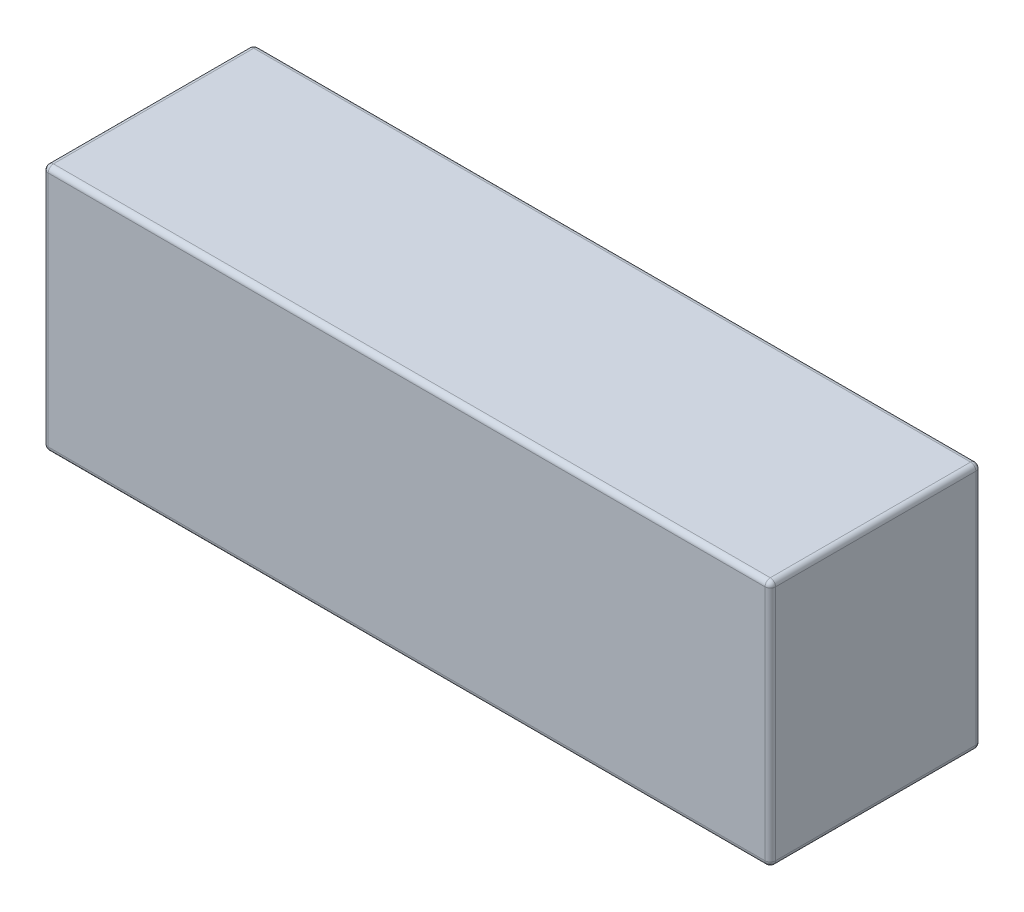
ISO-10303-21;
HEADER;
FILE_DESCRIPTION(('STEP AP214'),'2;1');
FILE_NAME('part.step','',(''),(''),'','','');
FILE_SCHEMA(('AUTOMOTIVE_DESIGN { 1 0 10303 214 1 1 1 1 }'));
ENDSEC;
DATA;
#1=APPLICATION_CONTEXT('core data for automotive mechanical design processes');
#2=APPLICATION_PROTOCOL_DEFINITION('international standard','automotive_design',2000,#1);
#3=PRODUCT_CONTEXT('',#1,'mechanical');
#4=PRODUCT('Part','Part','',(#3));
#5=PRODUCT_RELATED_PRODUCT_CATEGORY('part','',(#4));
#6=PRODUCT_DEFINITION_FORMATION('','',#4);
#7=PRODUCT_DEFINITION_CONTEXT('part definition',#1,'design');
#8=PRODUCT_DEFINITION('design','',#6,#7);
#9=PRODUCT_DEFINITION_SHAPE('','',#8);
#10=(LENGTH_UNIT() NAMED_UNIT(*) SI_UNIT(.MILLI.,.METRE.));
#11=(NAMED_UNIT(*) PLANE_ANGLE_UNIT() SI_UNIT($,.RADIAN.));
#12=(NAMED_UNIT(*) SI_UNIT($,.STERADIAN.) SOLID_ANGLE_UNIT());
#13=UNCERTAINTY_MEASURE_WITH_UNIT(LENGTH_MEASURE(1.E-05),#10,'distance_accuracy_value','');
#14=(GEOMETRIC_REPRESENTATION_CONTEXT(3) GLOBAL_UNCERTAINTY_ASSIGNED_CONTEXT((#13)) GLOBAL_UNIT_ASSIGNED_CONTEXT((#10,
#11,#12)) REPRESENTATION_CONTEXT('',''));
#15=CARTESIAN_POINT('',(0.,0.,0.));
#16=DIRECTION('',(0.,0.,1.));
#17=DIRECTION('',(1.,0.,0.));
#18=AXIS2_PLACEMENT_3D('',#15,#16,#17);
#19=CARTESIAN_POINT('',(69.,23.5,20.));
#20=DIRECTION('',(-1.,0.,0.));
#21=DIRECTION('',(0.,0.,1.));
#22=AXIS2_PLACEMENT_3D('',#19,#20,#21);
#23=PLANE('',#22);
#24=DIRECTION('',(0.,1.,0.));
#25=VECTOR('',#24,1.);
#26=CARTESIAN_POINT('',(69.,-23.5,19.));
#27=LINE('',#26,#25);
#28=CARTESIAN_POINT('',(69.,22.5,19.));
#29=VERTEX_POINT('',#28);
#30=CARTESIAN_POINT('',(69.,-22.5,19.));
#31=VERTEX_POINT('',#30);
#32=EDGE_CURVE('E271',#29,#31,#27,.F.);
#33=ORIENTED_EDGE('',*,*,#32,.T.);
#34=DIRECTION('',(0.,0.,-1.));
#35=VECTOR('',#34,1.);
#36=CARTESIAN_POINT('',(69.,-22.5,20.));
#37=LINE('',#36,#35);
#38=CARTESIAN_POINT('',(69.,-22.5,-19.));
#39=VERTEX_POINT('',#38);
#40=EDGE_CURVE('E11',#31,#39,#37,.T.);
#41=ORIENTED_EDGE('',*,*,#40,.T.);
#42=DIRECTION('',(0.,1.,0.));
#43=VECTOR('',#42,1.);
#44=CARTESIAN_POINT('',(69.,23.5,-19.));
#45=LINE('',#44,#43);
#46=CARTESIAN_POINT('',(69.,22.5,-19.));
#47=VERTEX_POINT('',#46);
#48=EDGE_CURVE('E53',#39,#47,#45,.T.);
#49=ORIENTED_EDGE('',*,*,#48,.T.);
#50=DIRECTION('',(0.,0.,-1.));
#51=VECTOR('',#50,1.);
#52=CARTESIAN_POINT('',(69.,22.5,20.));
#53=LINE('',#52,#51);
#54=EDGE_CURVE('E274',#47,#29,#53,.F.);
#55=ORIENTED_EDGE('',*,*,#54,.T.);
#56=EDGE_LOOP('',(#33,#41,#49,#55));
#57=FACE_BOUND('',#56,.T.);
#58=ADVANCED_FACE('F43',(#57),#23,.F.);
#59=CARTESIAN_POINT('',(-69.,23.5,20.));
#60=DIRECTION('',(0.,-1.,0.));
#61=DIRECTION('',(0.,0.,-1.));
#62=AXIS2_PLACEMENT_3D('',#59,#60,#61);
#63=PLANE('',#62);
#64=DIRECTION('',(-1.,0.,0.));
#65=VECTOR('',#64,1.);
#66=CARTESIAN_POINT('',(-69.,23.5,-19.));
#67=LINE('',#66,#65);
#68=CARTESIAN_POINT('',(68.,23.5,-19.));
#69=VERTEX_POINT('',#68);
#70=CARTESIAN_POINT('',(-68.,23.5,-19.));
#71=VERTEX_POINT('',#70);
#72=EDGE_CURVE('E241',#69,#71,#67,.T.);
#73=ORIENTED_EDGE('',*,*,#72,.T.);
#74=DIRECTION('',(0.,0.,-1.));
#75=VECTOR('',#74,1.);
#76=CARTESIAN_POINT('',(-68.,23.5,20.));
#77=LINE('',#76,#75);
#78=CARTESIAN_POINT('',(-68.,23.5,19.));
#79=VERTEX_POINT('',#78);
#80=EDGE_CURVE('E248',#71,#79,#77,.F.);
#81=ORIENTED_EDGE('',*,*,#80,.T.);
#82=DIRECTION('',(-1.,0.,0.));
#83=VECTOR('',#82,1.);
#84=CARTESIAN_POINT('',(69.,23.5,19.));
#85=LINE('',#84,#83);
#86=CARTESIAN_POINT('',(68.,23.5,19.));
#87=VERTEX_POINT('',#86);
#88=EDGE_CURVE('E245',#79,#87,#85,.F.);
#89=ORIENTED_EDGE('',*,*,#88,.T.);
#90=DIRECTION('',(0.,0.,-1.));
#91=VECTOR('',#90,1.);
#92=CARTESIAN_POINT('',(68.,23.5,20.));
#93=LINE('',#92,#91);
#94=EDGE_CURVE('E237',#87,#69,#93,.T.);
#95=ORIENTED_EDGE('',*,*,#94,.T.);
#96=EDGE_LOOP('',(#73,#81,#89,#95));
#97=FACE_BOUND('',#96,.T.);
#98=ADVANCED_FACE('F246',(#97),#63,.F.);
#99=CARTESIAN_POINT('',(-69.,23.5,20.));
#100=DIRECTION('',(1.,0.,0.));
#101=DIRECTION('',(0.,0.,-1.));
#102=AXIS2_PLACEMENT_3D('',#99,#100,#101);
#103=PLANE('',#102);
#104=DIRECTION('',(0.,-1.,0.));
#105=VECTOR('',#104,1.);
#106=CARTESIAN_POINT('',(-69.,23.5,-19.));
#107=LINE('',#106,#105);
#108=CARTESIAN_POINT('',(-69.,22.5,-19.));
#109=VERTEX_POINT('',#108);
#110=CARTESIAN_POINT('',(-69.,-22.5,-19.));
#111=VERTEX_POINT('',#110);
#112=EDGE_CURVE('E319',#109,#111,#107,.T.);
#113=ORIENTED_EDGE('',*,*,#112,.T.);
#114=DIRECTION('',(0.,0.,-1.));
#115=VECTOR('',#114,1.);
#116=CARTESIAN_POINT('',(-69.,-22.5,20.));
#117=LINE('',#116,#115);
#118=CARTESIAN_POINT('',(-69.,-22.5,19.));
#119=VERTEX_POINT('',#118);
#120=EDGE_CURVE('E313',#111,#119,#117,.F.);
#121=ORIENTED_EDGE('',*,*,#120,.T.);
#122=DIRECTION('',(0.,-1.,0.));
#123=VECTOR('',#122,1.);
#124=CARTESIAN_POINT('',(-69.,23.5,19.));
#125=LINE('',#124,#123);
#126=CARTESIAN_POINT('',(-69.,22.5,19.));
#127=VERTEX_POINT('',#126);
#128=EDGE_CURVE('E306',#119,#127,#125,.F.);
#129=ORIENTED_EDGE('',*,*,#128,.T.);
#130=DIRECTION('',(0.,0.,-1.));
#131=VECTOR('',#130,1.);
#132=CARTESIAN_POINT('',(-69.,22.5,20.));
#133=LINE('',#132,#131);
#134=EDGE_CURVE('E314',#127,#109,#133,.T.);
#135=ORIENTED_EDGE('',*,*,#134,.T.);
#136=EDGE_LOOP('',(#113,#121,#129,#135));
#137=FACE_BOUND('',#136,.T.);
#138=ADVANCED_FACE('F317',(#137),#103,.F.);
#139=CARTESIAN_POINT('',(-69.,-23.5,20.));
#140=DIRECTION('',(0.,1.,0.));
#141=DIRECTION('',(0.,0.,1.));
#142=AXIS2_PLACEMENT_3D('',#139,#140,#141);
#143=PLANE('',#142);
#144=DIRECTION('',(1.,0.,0.));
#145=VECTOR('',#144,1.);
#146=CARTESIAN_POINT('',(-69.,-23.5,19.));
#147=LINE('',#146,#145);
#148=CARTESIAN_POINT('',(68.,-23.5,19.));
#149=VERTEX_POINT('',#148);
#150=CARTESIAN_POINT('',(-68.,-23.5,19.));
#151=VERTEX_POINT('',#150);
#152=EDGE_CURVE('E147',#149,#151,#147,.F.);
#153=ORIENTED_EDGE('',*,*,#152,.T.);
#154=DIRECTION('',(0.,0.,-1.));
#155=VECTOR('',#154,1.);
#156=CARTESIAN_POINT('',(-68.,-23.5,20.));
#157=LINE('',#156,#155);
#158=CARTESIAN_POINT('',(-68.,-23.5,-19.));
#159=VERTEX_POINT('',#158);
#160=EDGE_CURVE('E142',#151,#159,#157,.T.);
#161=ORIENTED_EDGE('',*,*,#160,.T.);
#162=DIRECTION('',(1.,0.,0.));
#163=VECTOR('',#162,1.);
#164=CARTESIAN_POINT('',(-69.,-23.5,-19.));
#165=LINE('',#164,#163);
#166=CARTESIAN_POINT('',(68.,-23.5,-19.));
#167=VERTEX_POINT('',#166);
#168=EDGE_CURVE('E136',#159,#167,#165,.T.);
#169=ORIENTED_EDGE('',*,*,#168,.T.);
#170=DIRECTION('',(0.,0.,-1.));
#171=VECTOR('',#170,1.);
#172=CARTESIAN_POINT('',(68.,-23.5,20.));
#173=LINE('',#172,#171);
#174=EDGE_CURVE('E139',#167,#149,#173,.F.);
#175=ORIENTED_EDGE('',*,*,#174,.T.);
#176=EDGE_LOOP('',(#153,#161,#169,#175));
#177=FACE_BOUND('',#176,.T.);
#178=ADVANCED_FACE('F138',(#177),#143,.F.);
#179=CARTESIAN_POINT('',(0.,0.,20.));
#180=DIRECTION('',(0.,0.,1.));
#181=DIRECTION('',(1.,0.,0.));
#182=AXIS2_PLACEMENT_3D('',#179,#180,#181);
#183=PLANE('',#182);
#184=DIRECTION('',(0.,-1.,0.));
#185=VECTOR('',#184,1.);
#186=CARTESIAN_POINT('',(-68.,-23.5,20.));
#187=LINE('',#186,#185);
#188=CARTESIAN_POINT('',(-68.,22.5,20.));
#189=VERTEX_POINT('',#188);
#190=CARTESIAN_POINT('',(-68.,-22.5,20.));
#191=VERTEX_POINT('',#190);
#192=EDGE_CURVE('E333',#189,#191,#187,.T.);
#193=ORIENTED_EDGE('',*,*,#192,.T.);
#194=DIRECTION('',(1.,0.,0.));
#195=VECTOR('',#194,1.);
#196=CARTESIAN_POINT('',(69.,-22.5,20.));
#197=LINE('',#196,#195);
#198=CARTESIAN_POINT('',(68.,-22.5,20.));
#199=VERTEX_POINT('',#198);
#200=EDGE_CURVE('E242',#191,#199,#197,.T.);
#201=ORIENTED_EDGE('',*,*,#200,.T.);
#202=DIRECTION('',(0.,1.,0.));
#203=VECTOR('',#202,1.);
#204=CARTESIAN_POINT('',(68.,23.5,20.));
#205=LINE('',#204,#203);
#206=CARTESIAN_POINT('',(68.,22.5,20.));
#207=VERTEX_POINT('',#206);
#208=EDGE_CURVE('E324',#199,#207,#205,.T.);
#209=ORIENTED_EDGE('',*,*,#208,.T.);
#210=DIRECTION('',(-1.,0.,0.));
#211=VECTOR('',#210,1.);
#212=CARTESIAN_POINT('',(-69.,22.5,20.));
#213=LINE('',#212,#211);
#214=EDGE_CURVE('E327',#207,#189,#213,.T.);
#215=ORIENTED_EDGE('',*,*,#214,.T.);
#216=EDGE_LOOP('',(#193,#201,#209,#215));
#217=FACE_BOUND('',#216,.T.);
#218=ADVANCED_FACE('F340',(#217),#183,.T.);
#219=CARTESIAN_POINT('',(0.,0.,-20.));
#220=DIRECTION('',(0.,0.,1.));
#221=DIRECTION('',(1.,0.,0.));
#222=AXIS2_PLACEMENT_3D('',#219,#220,#221);
#223=PLANE('',#222);
#224=DIRECTION('',(0.,-1.,0.));
#225=VECTOR('',#224,1.);
#226=CARTESIAN_POINT('',(-68.,0.,-20.));
#227=LINE('',#226,#225);
#228=CARTESIAN_POINT('',(-68.,-22.5,-20.));
#229=VERTEX_POINT('',#228);
#230=CARTESIAN_POINT('',(-68.,22.5,-20.));
#231=VERTEX_POINT('',#230);
#232=EDGE_CURVE('E264',#229,#231,#227,.F.);
#233=ORIENTED_EDGE('',*,*,#232,.T.);
#234=DIRECTION('',(-1.,0.,0.));
#235=VECTOR('',#234,1.);
#236=CARTESIAN_POINT('',(0.,22.5,-20.));
#237=LINE('',#236,#235);
#238=CARTESIAN_POINT('',(68.,22.5,-20.));
#239=VERTEX_POINT('',#238);
#240=EDGE_CURVE('E267',#231,#239,#237,.F.);
#241=ORIENTED_EDGE('',*,*,#240,.T.);
#242=DIRECTION('',(0.,1.,0.));
#243=VECTOR('',#242,1.);
#244=CARTESIAN_POINT('',(68.,0.,-20.));
#245=LINE('',#244,#243);
#246=CARTESIAN_POINT('',(68.,-22.5,-20.));
#247=VERTEX_POINT('',#246);
#248=EDGE_CURVE('E256',#239,#247,#245,.F.);
#249=ORIENTED_EDGE('',*,*,#248,.T.);
#250=DIRECTION('',(1.,0.,0.));
#251=VECTOR('',#250,1.);
#252=CARTESIAN_POINT('',(0.,-22.5,-20.));
#253=LINE('',#252,#251);
#254=EDGE_CURVE('E164',#247,#229,#253,.F.);
#255=ORIENTED_EDGE('',*,*,#254,.T.);
#256=EDGE_LOOP('',(#233,#241,#249,#255));
#257=FACE_BOUND('',#256,.T.);
#258=ADVANCED_FACE('F414',(#257),#223,.F.);
#259=CARTESIAN_POINT('',(68.,22.5,20.));
#260=DIRECTION('',(0.,0.,-1.));
#261=DIRECTION('',(-1.,0.,0.));
#262=AXIS2_PLACEMENT_3D('',#259,#260,#261);
#263=CYLINDRICAL_SURFACE('',#262,1.);
#264=CARTESIAN_POINT('',(68.,22.5,19.));
#265=DIRECTION('',(0.,0.,1.));
#266=DIRECTION('',(1.,0.,0.));
#267=AXIS2_PLACEMENT_3D('',#264,#265,#266);
#268=CIRCLE('',#267,1.);
#269=EDGE_CURVE('E47',#29,#87,#268,.T.);
#270=ORIENTED_EDGE('',*,*,#269,.F.);
#271=ORIENTED_EDGE('',*,*,#54,.F.);
#272=CARTESIAN_POINT('',(68.,22.5,-19.));
#273=DIRECTION('',(0.,0.,-1.));
#274=DIRECTION('',(-1.,0.,0.));
#275=AXIS2_PLACEMENT_3D('',#272,#273,#274);
#276=CIRCLE('',#275,1.);
#277=EDGE_CURVE('E219',#69,#47,#276,.T.);
#278=ORIENTED_EDGE('',*,*,#277,.F.);
#279=ORIENTED_EDGE('',*,*,#94,.F.);
#280=EDGE_LOOP('',(#270,#271,#278,#279));
#281=FACE_BOUND('',#280,.T.);
#282=ADVANCED_FACE('F45',(#281),#263,.T.);
#283=CARTESIAN_POINT('',(68.,22.5,19.));
#284=DIRECTION('',(0.,1.,0.));
#285=DIRECTION('',(0.,0.,1.));
#286=AXIS2_PLACEMENT_3D('',#283,#284,#285);
#287=SPHERICAL_SURFACE('',#286,1.);
#288=CARTESIAN_POINT('',(68.,22.5,19.));
#289=DIRECTION('',(0.,1.,0.));
#290=DIRECTION('',(0.,0.,1.));
#291=AXIS2_PLACEMENT_3D('',#288,#289,#290);
#292=CIRCLE('',#291,1.);
#293=EDGE_CURVE('E213',#29,#207,#292,.F.);
#294=ORIENTED_EDGE('',*,*,#293,.F.);
#295=ORIENTED_EDGE('',*,*,#269,.T.);
#296=CARTESIAN_POINT('',(68.,22.5,19.));
#297=DIRECTION('',(1.,0.,0.));
#298=DIRECTION('',(0.,0.,-1.));
#299=AXIS2_PLACEMENT_3D('',#296,#297,#298);
#300=CIRCLE('',#299,1.);
#301=EDGE_CURVE('E217',#207,#87,#300,.F.);
#302=ORIENTED_EDGE('',*,*,#301,.F.);
#303=EDGE_LOOP('',(#294,#295,#302));
#304=FACE_BOUND('',#303,.T.);
#305=ADVANCED_FACE('F233',(#304),#287,.T.);
#306=CARTESIAN_POINT('',(68.,22.5,-19.));
#307=DIRECTION('',(1.,0.,0.));
#308=DIRECTION('',(0.,0.,-1.));
#309=AXIS2_PLACEMENT_3D('',#306,#307,#308);
#310=SPHERICAL_SURFACE('',#309,1.);
#311=CARTESIAN_POINT('',(68.,22.5,-19.));
#312=DIRECTION('',(1.,0.,0.));
#313=DIRECTION('',(0.,0.,-1.));
#314=AXIS2_PLACEMENT_3D('',#311,#312,#313);
#315=CIRCLE('',#314,1.);
#316=EDGE_CURVE('E205',#69,#239,#315,.F.);
#317=ORIENTED_EDGE('',*,*,#316,.F.);
#318=ORIENTED_EDGE('',*,*,#277,.T.);
#319=CARTESIAN_POINT('',(68.,22.5,-19.));
#320=DIRECTION('',(0.,1.,0.));
#321=DIRECTION('',(0.,0.,1.));
#322=AXIS2_PLACEMENT_3D('',#319,#320,#321);
#323=CIRCLE('',#322,1.);
#324=EDGE_CURVE('E209',#239,#47,#323,.F.);
#325=ORIENTED_EDGE('',*,*,#324,.F.);
#326=EDGE_LOOP('',(#317,#318,#325));
#327=FACE_BOUND('',#326,.T.);
#328=ADVANCED_FACE('F408',(#327),#310,.T.);
#329=CARTESIAN_POINT('',(0.,22.5,19.));
#330=DIRECTION('',(1.,0.,0.));
#331=DIRECTION('',(0.,0.,-1.));
#332=AXIS2_PLACEMENT_3D('',#329,#330,#331);
#333=CYLINDRICAL_SURFACE('',#332,1.);
#334=ORIENTED_EDGE('',*,*,#301,.T.);
#335=ORIENTED_EDGE('',*,*,#88,.F.);
#336=CARTESIAN_POINT('',(-68.,22.5,19.));
#337=DIRECTION('',(-1.,0.,0.));
#338=DIRECTION('',(0.,0.,1.));
#339=AXIS2_PLACEMENT_3D('',#336,#337,#338);
#340=CIRCLE('',#339,1.);
#341=EDGE_CURVE('E197',#189,#79,#340,.T.);
#342=ORIENTED_EDGE('',*,*,#341,.F.);
#343=ORIENTED_EDGE('',*,*,#214,.F.);
#344=EDGE_LOOP('',(#334,#335,#342,#343));
#345=FACE_BOUND('',#344,.T.);
#346=ADVANCED_FACE('F405',(#345),#333,.T.);
#347=CARTESIAN_POINT('',(68.,0.,19.));
#348=DIRECTION('',(0.,-1.,0.));
#349=DIRECTION('',(0.,0.,-1.));
#350=AXIS2_PLACEMENT_3D('',#347,#348,#349);
#351=CYLINDRICAL_SURFACE('',#350,1.);
#352=ORIENTED_EDGE('',*,*,#293,.T.);
#353=ORIENTED_EDGE('',*,*,#208,.F.);
#354=CARTESIAN_POINT('',(68.,-22.5,19.));
#355=DIRECTION('',(0.,-1.,0.));
#356=DIRECTION('',(0.,0.,-1.));
#357=AXIS2_PLACEMENT_3D('',#354,#355,#356);
#358=CIRCLE('',#357,1.);
#359=EDGE_CURVE('E193',#31,#199,#358,.T.);
#360=ORIENTED_EDGE('',*,*,#359,.F.);
#361=ORIENTED_EDGE('',*,*,#32,.F.);
#362=EDGE_LOOP('',(#352,#353,#360,#361));
#363=FACE_BOUND('',#362,.T.);
#364=ADVANCED_FACE('F349',(#363),#351,.T.);
#365=CARTESIAN_POINT('',(68.,-22.5,20.));
#366=DIRECTION('',(0.,0.,-1.));
#367=DIRECTION('',(-1.,0.,0.));
#368=AXIS2_PLACEMENT_3D('',#365,#366,#367);
#369=CYLINDRICAL_SURFACE('',#368,1.);
#370=CARTESIAN_POINT('',(68.,-22.5,-19.));
#371=DIRECTION('',(0.,0.,-1.));
#372=DIRECTION('',(-1.,0.,0.));
#373=AXIS2_PLACEMENT_3D('',#370,#371,#372);
#374=CIRCLE('',#373,1.);
#375=EDGE_CURVE('E152',#39,#167,#374,.T.);
#376=ORIENTED_EDGE('',*,*,#375,.F.);
#377=ORIENTED_EDGE('',*,*,#40,.F.);
#378=CARTESIAN_POINT('',(68.,-22.5,19.));
#379=DIRECTION('',(0.,0.,1.));
#380=DIRECTION('',(1.,0.,0.));
#381=AXIS2_PLACEMENT_3D('',#378,#379,#380);
#382=CIRCLE('',#381,1.);
#383=EDGE_CURVE('E154',#149,#31,#382,.T.);
#384=ORIENTED_EDGE('',*,*,#383,.F.);
#385=ORIENTED_EDGE('',*,*,#174,.F.);
#386=EDGE_LOOP('',(#376,#377,#384,#385));
#387=FACE_BOUND('',#386,.T.);
#388=ADVANCED_FACE('F150',(#387),#369,.T.);
#389=CARTESIAN_POINT('',(68.,23.5,-19.));
#390=DIRECTION('',(0.,1.,0.));
#391=DIRECTION('',(0.,0.,1.));
#392=AXIS2_PLACEMENT_3D('',#389,#390,#391);
#393=CYLINDRICAL_SURFACE('',#392,1.);
#394=ORIENTED_EDGE('',*,*,#324,.T.);
#395=ORIENTED_EDGE('',*,*,#48,.F.);
#396=CARTESIAN_POINT('',(68.,-22.5,-19.));
#397=DIRECTION('',(0.,-1.,0.));
#398=DIRECTION('',(0.,0.,-1.));
#399=AXIS2_PLACEMENT_3D('',#396,#397,#398);
#400=CIRCLE('',#399,1.);
#401=EDGE_CURVE('E61',#247,#39,#400,.T.);
#402=ORIENTED_EDGE('',*,*,#401,.F.);
#403=ORIENTED_EDGE('',*,*,#248,.F.);
#404=EDGE_LOOP('',(#394,#395,#402,#403));
#405=FACE_BOUND('',#404,.T.);
#406=ADVANCED_FACE('F396',(#405),#393,.T.);
#407=CARTESIAN_POINT('',(-69.,22.5,-19.));
#408=DIRECTION('',(-1.,0.,0.));
#409=DIRECTION('',(0.,0.,1.));
#410=AXIS2_PLACEMENT_3D('',#407,#408,#409);
#411=CYLINDRICAL_SURFACE('',#410,1.);
#412=ORIENTED_EDGE('',*,*,#316,.T.);
#413=ORIENTED_EDGE('',*,*,#240,.F.);
#414=CARTESIAN_POINT('',(-68.,22.5,-19.));
#415=DIRECTION('',(-1.,0.,0.));
#416=DIRECTION('',(0.,0.,1.));
#417=AXIS2_PLACEMENT_3D('',#414,#415,#416);
#418=CIRCLE('',#417,1.);
#419=EDGE_CURVE('E185',#71,#231,#418,.T.);
#420=ORIENTED_EDGE('',*,*,#419,.F.);
#421=ORIENTED_EDGE('',*,*,#72,.F.);
#422=EDGE_LOOP('',(#412,#413,#420,#421));
#423=FACE_BOUND('',#422,.T.);
#424=ADVANCED_FACE('F392',(#423),#411,.T.);
#425=CARTESIAN_POINT('',(-68.,22.5,20.));
#426=DIRECTION('',(0.,0.,-1.));
#427=DIRECTION('',(-1.,0.,0.));
#428=AXIS2_PLACEMENT_3D('',#425,#426,#427);
#429=CYLINDRICAL_SURFACE('',#428,1.);
#430=CARTESIAN_POINT('',(-68.,22.5,19.));
#431=DIRECTION('',(0.,0.,1.));
#432=DIRECTION('',(1.,0.,0.));
#433=AXIS2_PLACEMENT_3D('',#430,#431,#432);
#434=CIRCLE('',#433,1.);
#435=EDGE_CURVE('E201',#79,#127,#434,.T.);
#436=ORIENTED_EDGE('',*,*,#435,.F.);
#437=ORIENTED_EDGE('',*,*,#80,.F.);
#438=CARTESIAN_POINT('',(-68.,22.5,-19.));
#439=DIRECTION('',(0.,0.,-1.));
#440=DIRECTION('',(-1.,0.,0.));
#441=AXIS2_PLACEMENT_3D('',#438,#439,#440);
#442=CIRCLE('',#441,1.);
#443=EDGE_CURVE('E181',#109,#71,#442,.T.);
#444=ORIENTED_EDGE('',*,*,#443,.F.);
#445=ORIENTED_EDGE('',*,*,#134,.F.);
#446=EDGE_LOOP('',(#436,#437,#444,#445));
#447=FACE_BOUND('',#446,.T.);
#448=ADVANCED_FACE('F388',(#447),#429,.T.);
#449=CARTESIAN_POINT('',(-68.,22.5,19.));
#450=DIRECTION('',(0.,1.,0.));
#451=DIRECTION('',(0.,0.,1.));
#452=AXIS2_PLACEMENT_3D('',#449,#450,#451);
#453=SPHERICAL_SURFACE('',#452,1.);
#454=ORIENTED_EDGE('',*,*,#341,.T.);
#455=ORIENTED_EDGE('',*,*,#435,.T.);
#456=CARTESIAN_POINT('',(-68.,22.5,19.));
#457=DIRECTION('',(0.,1.,0.));
#458=DIRECTION('',(0.,0.,1.));
#459=AXIS2_PLACEMENT_3D('',#456,#457,#458);
#460=CIRCLE('',#459,1.);
#461=EDGE_CURVE('E171',#189,#127,#460,.F.);
#462=ORIENTED_EDGE('',*,*,#461,.F.);
#463=EDGE_LOOP('',(#454,#455,#462));
#464=FACE_BOUND('',#463,.T.);
#465=ADVANCED_FACE('F385',(#464),#453,.T.);
#466=CARTESIAN_POINT('',(68.,-22.5,19.));
#467=DIRECTION('',(1.,0.,0.));
#468=DIRECTION('',(0.,0.,-1.));
#469=AXIS2_PLACEMENT_3D('',#466,#467,#468);
#470=SPHERICAL_SURFACE('',#469,1.);
#471=ORIENTED_EDGE('',*,*,#383,.T.);
#472=ORIENTED_EDGE('',*,*,#359,.T.);
#473=CARTESIAN_POINT('',(68.,-22.5,19.));
#474=DIRECTION('',(1.,0.,0.));
#475=DIRECTION('',(0.,0.,-1.));
#476=AXIS2_PLACEMENT_3D('',#473,#474,#475);
#477=CIRCLE('',#476,1.);
#478=EDGE_CURVE('E166',#149,#199,#477,.F.);
#479=ORIENTED_EDGE('',*,*,#478,.F.);
#480=EDGE_LOOP('',(#471,#472,#479));
#481=FACE_BOUND('',#480,.T.);
#482=ADVANCED_FACE('F347',(#481),#470,.T.);
#483=CARTESIAN_POINT('',(68.,-22.5,-19.));
#484=DIRECTION('',(1.,0.,0.));
#485=DIRECTION('',(0.,0.,-1.));
#486=AXIS2_PLACEMENT_3D('',#483,#484,#485);
#487=SPHERICAL_SURFACE('',#486,1.);
#488=ORIENTED_EDGE('',*,*,#401,.T.);
#489=ORIENTED_EDGE('',*,*,#375,.T.);
#490=CARTESIAN_POINT('',(68.,-22.5,-19.));
#491=DIRECTION('',(1.,0.,0.));
#492=DIRECTION('',(0.,0.,-1.));
#493=AXIS2_PLACEMENT_3D('',#490,#491,#492);
#494=CIRCLE('',#493,1.);
#495=EDGE_CURVE('E159',#247,#167,#494,.F.);
#496=ORIENTED_EDGE('',*,*,#495,.F.);
#497=EDGE_LOOP('',(#488,#489,#496));
#498=FACE_BOUND('',#497,.T.);
#499=ADVANCED_FACE('F158',(#498),#487,.T.);
#500=CARTESIAN_POINT('',(-68.,22.5,-19.));
#501=DIRECTION('',(0.,1.,0.));
#502=DIRECTION('',(0.,0.,1.));
#503=AXIS2_PLACEMENT_3D('',#500,#501,#502);
#504=SPHERICAL_SURFACE('',#503,1.);
#505=ORIENTED_EDGE('',*,*,#443,.T.);
#506=ORIENTED_EDGE('',*,*,#419,.T.);
#507=CARTESIAN_POINT('',(-68.,22.5,-19.));
#508=DIRECTION('',(0.,1.,0.));
#509=DIRECTION('',(0.,0.,1.));
#510=AXIS2_PLACEMENT_3D('',#507,#508,#509);
#511=CIRCLE('',#510,1.);
#512=EDGE_CURVE('E167',#109,#231,#511,.F.);
#513=ORIENTED_EDGE('',*,*,#512,.F.);
#514=EDGE_LOOP('',(#505,#506,#513));
#515=FACE_BOUND('',#514,.T.);
#516=ADVANCED_FACE('F377',(#515),#504,.T.);
#517=CARTESIAN_POINT('',(-68.,0.,19.));
#518=DIRECTION('',(0.,1.,0.));
#519=DIRECTION('',(0.,0.,1.));
#520=AXIS2_PLACEMENT_3D('',#517,#518,#519);
#521=CYLINDRICAL_SURFACE('',#520,1.);
#522=ORIENTED_EDGE('',*,*,#461,.T.);
#523=ORIENTED_EDGE('',*,*,#128,.F.);
#524=CARTESIAN_POINT('',(-68.,-22.5,19.));
#525=DIRECTION('',(0.,-1.,0.));
#526=DIRECTION('',(0.,0.,-1.));
#527=AXIS2_PLACEMENT_3D('',#524,#525,#526);
#528=CIRCLE('',#527,1.);
#529=EDGE_CURVE('E174',#191,#119,#528,.T.);
#530=ORIENTED_EDGE('',*,*,#529,.F.);
#531=ORIENTED_EDGE('',*,*,#192,.F.);
#532=EDGE_LOOP('',(#522,#523,#530,#531));
#533=FACE_BOUND('',#532,.T.);
#534=ADVANCED_FACE('F308',(#533),#521,.T.);
#535=CARTESIAN_POINT('',(0.,-22.5,19.));
#536=DIRECTION('',(-1.,0.,0.));
#537=DIRECTION('',(0.,0.,1.));
#538=AXIS2_PLACEMENT_3D('',#535,#536,#537);
#539=CYLINDRICAL_SURFACE('',#538,1.);
#540=ORIENTED_EDGE('',*,*,#478,.T.);
#541=ORIENTED_EDGE('',*,*,#200,.F.);
#542=CARTESIAN_POINT('',(-68.,-22.5,19.));
#543=DIRECTION('',(-1.,0.,0.));
#544=DIRECTION('',(0.,0.,1.));
#545=AXIS2_PLACEMENT_3D('',#542,#543,#544);
#546=CIRCLE('',#545,1.);
#547=EDGE_CURVE('E293',#151,#191,#546,.T.);
#548=ORIENTED_EDGE('',*,*,#547,.F.);
#549=ORIENTED_EDGE('',*,*,#152,.F.);
#550=EDGE_LOOP('',(#540,#541,#548,#549));
#551=FACE_BOUND('',#550,.T.);
#552=ADVANCED_FACE('F343',(#551),#539,.T.);
#553=CARTESIAN_POINT('',(-69.,-22.5,-19.));
#554=DIRECTION('',(1.,0.,0.));
#555=DIRECTION('',(0.,0.,-1.));
#556=AXIS2_PLACEMENT_3D('',#553,#554,#555);
#557=CYLINDRICAL_SURFACE('',#556,1.);
#558=ORIENTED_EDGE('',*,*,#495,.T.);
#559=ORIENTED_EDGE('',*,*,#168,.F.);
#560=CARTESIAN_POINT('',(-68.,-22.5,-19.));
#561=DIRECTION('',(-1.,0.,0.));
#562=DIRECTION('',(0.,0.,1.));
#563=AXIS2_PLACEMENT_3D('',#560,#561,#562);
#564=CIRCLE('',#563,1.);
#565=EDGE_CURVE('E289',#229,#159,#564,.T.);
#566=ORIENTED_EDGE('',*,*,#565,.F.);
#567=ORIENTED_EDGE('',*,*,#254,.F.);
#568=EDGE_LOOP('',(#558,#559,#566,#567));
#569=FACE_BOUND('',#568,.T.);
#570=ADVANCED_FACE('F163',(#569),#557,.T.);
#571=CARTESIAN_POINT('',(-68.,23.5,-19.));
#572=DIRECTION('',(0.,-1.,0.));
#573=DIRECTION('',(0.,0.,-1.));
#574=AXIS2_PLACEMENT_3D('',#571,#572,#573);
#575=CYLINDRICAL_SURFACE('',#574,1.);
#576=ORIENTED_EDGE('',*,*,#512,.T.);
#577=ORIENTED_EDGE('',*,*,#232,.F.);
#578=CARTESIAN_POINT('',(-68.,-22.5,-19.));
#579=DIRECTION('',(0.,-1.,0.));
#580=DIRECTION('',(0.,0.,-1.));
#581=AXIS2_PLACEMENT_3D('',#578,#579,#580);
#582=CIRCLE('',#581,1.);
#583=EDGE_CURVE('E285',#111,#229,#582,.T.);
#584=ORIENTED_EDGE('',*,*,#583,.F.);
#585=ORIENTED_EDGE('',*,*,#112,.F.);
#586=EDGE_LOOP('',(#576,#577,#584,#585));
#587=FACE_BOUND('',#586,.T.);
#588=ADVANCED_FACE('F367',(#587),#575,.T.);
#589=CARTESIAN_POINT('',(-68.,-22.5,19.));
#590=DIRECTION('',(0.,0.,1.));
#591=DIRECTION('',(1.,0.,0.));
#592=AXIS2_PLACEMENT_3D('',#589,#590,#591);
#593=SPHERICAL_SURFACE('',#592,1.);
#594=ORIENTED_EDGE('',*,*,#547,.T.);
#595=ORIENTED_EDGE('',*,*,#529,.T.);
#596=CARTESIAN_POINT('',(-68.,-22.5,19.));
#597=DIRECTION('',(0.,0.,1.));
#598=DIRECTION('',(1.,0.,0.));
#599=AXIS2_PLACEMENT_3D('',#596,#597,#598);
#600=CIRCLE('',#599,1.);
#601=EDGE_CURVE('E282',#151,#119,#600,.F.);
#602=ORIENTED_EDGE('',*,*,#601,.F.);
#603=EDGE_LOOP('',(#594,#595,#602));
#604=FACE_BOUND('',#603,.T.);
#605=ADVANCED_FACE('F302',(#604),#593,.T.);
#606=CARTESIAN_POINT('',(-68.,-22.5,-19.));
#607=DIRECTION('',(0.,0.,-1.));
#608=DIRECTION('',(-1.,0.,0.));
#609=AXIS2_PLACEMENT_3D('',#606,#607,#608);
#610=SPHERICAL_SURFACE('',#609,1.);
#611=ORIENTED_EDGE('',*,*,#583,.T.);
#612=ORIENTED_EDGE('',*,*,#565,.T.);
#613=CARTESIAN_POINT('',(-68.,-22.5,-19.));
#614=DIRECTION('',(0.,0.,-1.));
#615=DIRECTION('',(-1.,0.,0.));
#616=AXIS2_PLACEMENT_3D('',#613,#614,#615);
#617=CIRCLE('',#616,1.);
#618=EDGE_CURVE('E279',#111,#159,#617,.F.);
#619=ORIENTED_EDGE('',*,*,#618,.F.);
#620=EDGE_LOOP('',(#611,#612,#619));
#621=FACE_BOUND('',#620,.T.);
#622=ADVANCED_FACE('F361',(#621),#610,.T.);
#623=CARTESIAN_POINT('',(-68.,-22.5,20.));
#624=DIRECTION('',(0.,0.,-1.));
#625=DIRECTION('',(-1.,0.,0.));
#626=AXIS2_PLACEMENT_3D('',#623,#624,#625);
#627=CYLINDRICAL_SURFACE('',#626,1.);
#628=ORIENTED_EDGE('',*,*,#601,.T.);
#629=ORIENTED_EDGE('',*,*,#120,.F.);
#630=ORIENTED_EDGE('',*,*,#618,.T.);
#631=ORIENTED_EDGE('',*,*,#160,.F.);
#632=EDGE_LOOP('',(#628,#629,#630,#631));
#633=FACE_BOUND('',#632,.T.);
#634=ADVANCED_FACE('F358',(#633),#627,.T.);
#635=CLOSED_SHELL('',(#58,#98,#138,#178,#218,#258,#282,#305,#328,#346,#364,#388,#406,#424,#448,
#465,#482,#499,#516,#534,#552,#570,#588,#605,#622,#634));
#636=MANIFOLD_SOLID_BREP('B2',#635);
#637=ADVANCED_BREP_SHAPE_REPRESENTATION('',(#18,#636),#14);
#638=SHAPE_DEFINITION_REPRESENTATION(#9,#637);
ENDSEC;
END-ISO-10303-21;
